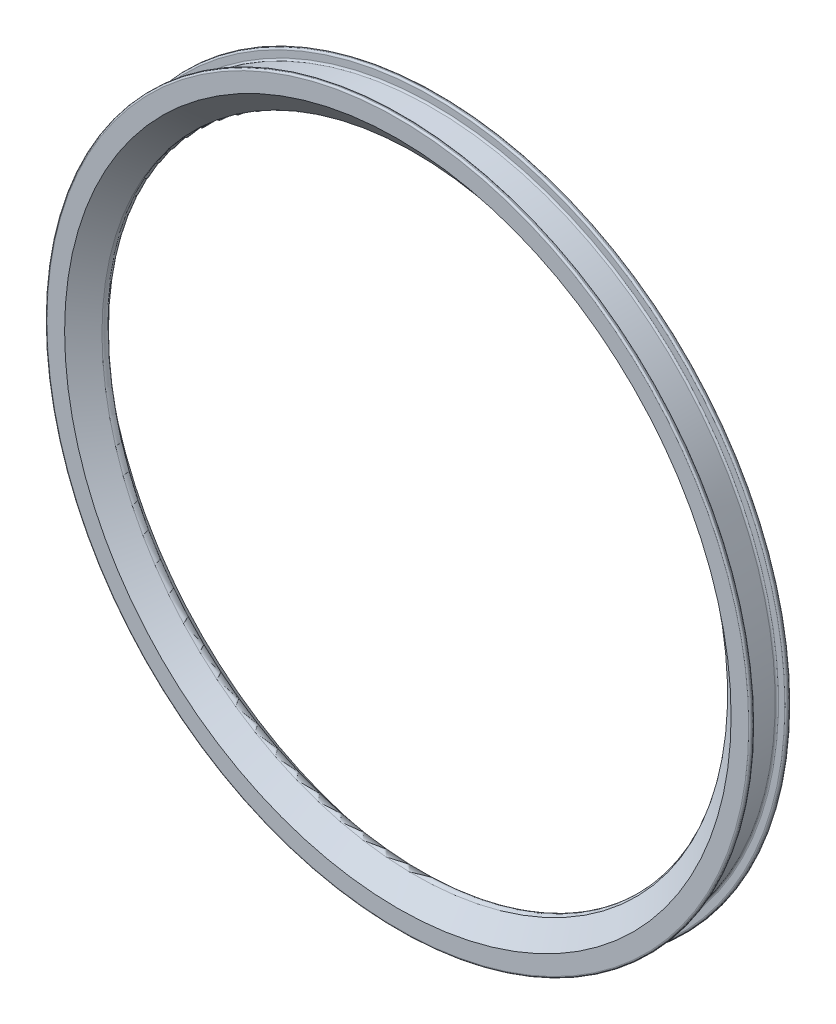
ISO-10303-21;
HEADER;
FILE_DESCRIPTION(('STEP AP214'),'2;1');
FILE_NAME('part.step','',(''),(''),'','','');
FILE_SCHEMA(('AUTOMOTIVE_DESIGN { 1 0 10303 214 1 1 1 1 }'));
ENDSEC;
DATA;
#1=APPLICATION_CONTEXT('core data for automotive mechanical design processes');
#2=APPLICATION_PROTOCOL_DEFINITION('international standard','automotive_design',2000,#1);
#3=PRODUCT_CONTEXT('',#1,'mechanical');
#4=PRODUCT('Part','Part','',(#3));
#5=PRODUCT_RELATED_PRODUCT_CATEGORY('part','',(#4));
#6=PRODUCT_DEFINITION_FORMATION('','',#4);
#7=PRODUCT_DEFINITION_CONTEXT('part definition',#1,'design');
#8=PRODUCT_DEFINITION('design','',#6,#7);
#9=PRODUCT_DEFINITION_SHAPE('','',#8);
#10=(LENGTH_UNIT() NAMED_UNIT(*) SI_UNIT(.MILLI.,.METRE.));
#11=(NAMED_UNIT(*) PLANE_ANGLE_UNIT() SI_UNIT($,.RADIAN.));
#12=(NAMED_UNIT(*) SI_UNIT($,.STERADIAN.) SOLID_ANGLE_UNIT());
#13=UNCERTAINTY_MEASURE_WITH_UNIT(LENGTH_MEASURE(1.E-05),#10,'distance_accuracy_value','');
#14=(GEOMETRIC_REPRESENTATION_CONTEXT(3) GLOBAL_UNCERTAINTY_ASSIGNED_CONTEXT((#13)) GLOBAL_UNIT_ASSIGNED_CONTEXT((#10,
#11,#12)) REPRESENTATION_CONTEXT('',''));
#15=CARTESIAN_POINT('',(0.,0.,0.));
#16=DIRECTION('',(0.,0.,1.));
#17=DIRECTION('',(1.,0.,0.));
#18=AXIS2_PLACEMENT_3D('',#15,#16,#17);
#19=CARTESIAN_POINT('',(0.,0.,0.));
#20=DIRECTION('',(0.,0.,1.));
#21=DIRECTION('',(1.,0.,0.));
#22=AXIS2_PLACEMENT_3D('',#19,#20,#21);
#23=CONICAL_SURFACE('',#22,184.,0.879459398025439);
#24=CARTESIAN_POINT('',(0.,0.,1.92598580281172));
#25=DIRECTION('',(0.,0.,-1.));
#26=DIRECTION('',(-1.,0.,0.));
#27=AXIS2_PLACEMENT_3D('',#24,#25,#26);
#28=CIRCLE('',#27,186.327232845064);
#29=CARTESIAN_POINT('',(-186.327232845064,0.,1.92598580281175));
#30=VERTEX_POINT('',#29);
#31=EDGE_CURVE('E80',#30,#30,#28,.T.);
#32=ORIENTED_EDGE('',*,*,#31,.T.);
#33=EDGE_LOOP('',(#32));
#34=FACE_BOUND('',#33,.T.);
#35=CARTESIAN_POINT('',(0.,0.,11.9999999999999));
#36=DIRECTION('',(0.,0.,-1.));
#37=DIRECTION('',(-1.,0.,0.));
#38=AXIS2_PLACEMENT_3D('',#35,#36,#37);
#39=CIRCLE('',#38,198.5);
#40=CARTESIAN_POINT('',(-198.5,0.,11.9999999999999));
#41=VERTEX_POINT('',#40);
#42=EDGE_CURVE('E86',#41,#41,#39,.T.);
#43=ORIENTED_EDGE('',*,*,#42,.F.);
#44=EDGE_LOOP('',(#43));
#45=FACE_BOUND('',#44,.T.);
#46=ADVANCED_FACE('F33',(#34,#45),#23,.F.);
#47=CARTESIAN_POINT('',(0.,0.,-12.0000000000001));
#48=DIRECTION('',(0.,0.,-1.));
#49=DIRECTION('',(-1.,0.,0.));
#50=AXIS2_PLACEMENT_3D('',#47,#48,#49);
#51=CONICAL_SURFACE('',#50,198.5,0.879459398025429);
#52=CARTESIAN_POINT('',(0.,0.,-1.92598580281172));
#53=DIRECTION('',(0.,0.,1.));
#54=DIRECTION('',(1.,0.,0.));
#55=AXIS2_PLACEMENT_3D('',#52,#53,#54);
#56=CIRCLE('',#55,186.327232845064);
#57=CARTESIAN_POINT('',(186.327232845064,0.,-1.92598580281175));
#58=VERTEX_POINT('',#57);
#59=EDGE_CURVE('E77',#58,#58,#56,.T.);
#60=ORIENTED_EDGE('',*,*,#59,.T.);
#61=EDGE_LOOP('',(#60));
#62=FACE_BOUND('',#61,.T.);
#63=CARTESIAN_POINT('',(0.,0.,-12.0000000000001));
#64=DIRECTION('',(0.,0.,-1.));
#65=DIRECTION('',(-1.,0.,0.));
#66=AXIS2_PLACEMENT_3D('',#63,#64,#65);
#67=CIRCLE('',#66,198.5);
#68=CARTESIAN_POINT('',(-198.5,0.,-12.0000000000001));
#69=VERTEX_POINT('',#68);
#70=EDGE_CURVE('E83',#69,#69,#67,.T.);
#71=ORIENTED_EDGE('',*,*,#70,.T.);
#72=EDGE_LOOP('',(#71));
#73=FACE_BOUND('',#72,.T.);
#74=ADVANCED_FACE('F93',(#62,#73),#51,.F.);
#75=CARTESIAN_POINT('',(198.5,0.,-12.0000000000001));
#76=DIRECTION('',(0.,0.,1.));
#77=DIRECTION('',(1.,0.,0.));
#78=AXIS2_PLACEMENT_3D('',#75,#76,#77);
#79=PLANE('',#78);
#80=CARTESIAN_POINT('',(0.,0.,-12.0000000000001));
#81=DIRECTION('',(0.,0.,1.));
#82=DIRECTION('',(1.,0.,0.));
#83=AXIS2_PLACEMENT_3D('',#80,#81,#82);
#84=CIRCLE('',#83,209.);
#85=CARTESIAN_POINT('',(209.,0.,-12.0000000000001));
#86=VERTEX_POINT('',#85);
#87=EDGE_CURVE('E44',#86,#86,#84,.F.);
#88=ORIENTED_EDGE('',*,*,#87,.T.);
#89=EDGE_LOOP('',(#88));
#90=FACE_BOUND('',#89,.T.);
#91=ORIENTED_EDGE('',*,*,#70,.F.);
#92=EDGE_LOOP('',(#91));
#93=FACE_BOUND('',#92,.T.);
#94=ADVANCED_FACE('F99',(#90,#93),#79,.F.);
#95=CARTESIAN_POINT('',(0.,0.,-28.4424478528471));
#96=DIRECTION('',(0.,0.,-1.));
#97=DIRECTION('',(-1.,0.,0.));
#98=AXIS2_PLACEMENT_3D('',#95,#96,#97);
#99=CYLINDRICAL_SURFACE('',#98,210.);
#100=CARTESIAN_POINT('',(0.,0.,-10.5000000000001));
#101=DIRECTION('',(0.,0.,-1.));
#102=DIRECTION('',(-1.,0.,0.));
#103=AXIS2_PLACEMENT_3D('',#100,#101,#102);
#104=CIRCLE('',#103,210.);
#105=CARTESIAN_POINT('',(-210.,0.,-10.5000000000001));
#106=VERTEX_POINT('',#105);
#107=EDGE_CURVE('E56',#106,#106,#104,.T.);
#108=ORIENTED_EDGE('',*,*,#107,.T.);
#109=EDGE_LOOP('',(#108));
#110=FACE_BOUND('',#109,.T.);
#111=CARTESIAN_POINT('',(0.,0.,-11.0000000000001));
#112=DIRECTION('',(0.,0.,1.));
#113=DIRECTION('',(1.,0.,0.));
#114=AXIS2_PLACEMENT_3D('',#111,#112,#113);
#115=CIRCLE('',#114,210.);
#116=CARTESIAN_POINT('',(210.,0.,-11.0000000000001));
#117=VERTEX_POINT('',#116);
#118=EDGE_CURVE('E59',#117,#117,#115,.T.);
#119=ORIENTED_EDGE('',*,*,#118,.T.);
#120=EDGE_LOOP('',(#119));
#121=FACE_BOUND('',#120,.T.);
#122=ADVANCED_FACE('F151',(#110,#121),#99,.T.);
#123=CARTESIAN_POINT('',(210.,0.,-9.50000000000012));
#124=DIRECTION('',(0.,0.,-1.));
#125=DIRECTION('',(-1.,0.,0.));
#126=AXIS2_PLACEMENT_3D('',#123,#124,#125);
#127=PLANE('',#126);
#128=CARTESIAN_POINT('',(0.,0.,-9.50000000000009));
#129=DIRECTION('',(0.,0.,-1.));
#130=DIRECTION('',(-1.,0.,0.));
#131=AXIS2_PLACEMENT_3D('',#128,#129,#130);
#132=CIRCLE('',#131,209.);
#133=CARTESIAN_POINT('',(-209.,0.,-9.50000000000006));
#134=VERTEX_POINT('',#133);
#135=EDGE_CURVE('E48',#134,#134,#132,.F.);
#136=ORIENTED_EDGE('',*,*,#135,.T.);
#137=EDGE_LOOP('',(#136));
#138=FACE_BOUND('',#137,.T.);
#139=CARTESIAN_POINT('',(0.,0.,-9.50000000000009));
#140=DIRECTION('',(0.,0.,-1.));
#141=DIRECTION('',(-1.,0.,0.));
#142=AXIS2_PLACEMENT_3D('',#139,#140,#141);
#143=CIRCLE('',#142,205.25);
#144=CARTESIAN_POINT('',(-205.25,0.,-9.50000000000006));
#145=VERTEX_POINT('',#144);
#146=EDGE_CURVE('E53',#145,#145,#143,.T.);
#147=ORIENTED_EDGE('',*,*,#146,.T.);
#148=EDGE_LOOP('',(#147));
#149=FACE_BOUND('',#148,.T.);
#150=ADVANCED_FACE('F145',(#138,#149),#127,.F.);
#151=CARTESIAN_POINT('',(0.,0.,-28.4424478528471));
#152=DIRECTION('',(0.,0.,-1.));
#153=DIRECTION('',(-1.,0.,0.));
#154=AXIS2_PLACEMENT_3D('',#151,#152,#153);
#155=CYLINDRICAL_SURFACE('',#154,204.25);
#156=CARTESIAN_POINT('',(0.,0.,8.49999999999991));
#157=DIRECTION('',(0.,0.,1.));
#158=DIRECTION('',(1.,0.,0.));
#159=AXIS2_PLACEMENT_3D('',#156,#157,#158);
#160=CIRCLE('',#159,204.25);
#161=CARTESIAN_POINT('',(204.25,0.,8.49999999999988));
#162=VERTEX_POINT('',#161);
#163=EDGE_CURVE('E10',#162,#162,#160,.F.);
#164=ORIENTED_EDGE('',*,*,#163,.T.);
#165=EDGE_LOOP('',(#164));
#166=FACE_BOUND('',#165,.T.);
#167=CARTESIAN_POINT('',(0.,0.,-8.50000000000009));
#168=DIRECTION('',(0.,0.,-1.));
#169=DIRECTION('',(-1.,0.,0.));
#170=AXIS2_PLACEMENT_3D('',#167,#168,#169);
#171=CIRCLE('',#170,204.25);
#172=CARTESIAN_POINT('',(-204.25,0.,-8.50000000000006));
#173=VERTEX_POINT('',#172);
#174=EDGE_CURVE('E40',#173,#173,#171,.F.);
#175=ORIENTED_EDGE('',*,*,#174,.T.);
#176=EDGE_LOOP('',(#175));
#177=FACE_BOUND('',#176,.T.);
#178=ADVANCED_FACE('F136',(#166,#177),#155,.T.);
#179=CARTESIAN_POINT('',(204.25,0.,9.49999999999988));
#180=DIRECTION('',(0.,0.,1.));
#181=DIRECTION('',(1.,0.,0.));
#182=AXIS2_PLACEMENT_3D('',#179,#180,#181);
#183=PLANE('',#182);
#184=CARTESIAN_POINT('',(0.,0.,9.49999999999991));
#185=DIRECTION('',(0.,0.,1.));
#186=DIRECTION('',(1.,0.,0.));
#187=AXIS2_PLACEMENT_3D('',#184,#185,#186);
#188=CIRCLE('',#187,209.);
#189=CARTESIAN_POINT('',(209.,0.,9.49999999999988));
#190=VERTEX_POINT('',#189);
#191=EDGE_CURVE('E62',#190,#190,#188,.F.);
#192=ORIENTED_EDGE('',*,*,#191,.T.);
#193=EDGE_LOOP('',(#192));
#194=FACE_BOUND('',#193,.T.);
#195=CARTESIAN_POINT('',(0.,0.,9.49999999999991));
#196=DIRECTION('',(0.,0.,1.));
#197=DIRECTION('',(1.,0.,0.));
#198=AXIS2_PLACEMENT_3D('',#195,#196,#197);
#199=CIRCLE('',#198,205.25);
#200=CARTESIAN_POINT('',(205.25,0.,9.49999999999988));
#201=VERTEX_POINT('',#200);
#202=EDGE_CURVE('E65',#201,#201,#199,.T.);
#203=ORIENTED_EDGE('',*,*,#202,.T.);
#204=EDGE_LOOP('',(#203));
#205=FACE_BOUND('',#204,.T.);
#206=ADVANCED_FACE('F133',(#194,#205),#183,.F.);
#207=CARTESIAN_POINT('',(0.,0.,-28.4424478528471));
#208=DIRECTION('',(0.,0.,-1.));
#209=DIRECTION('',(-1.,0.,0.));
#210=AXIS2_PLACEMENT_3D('',#207,#208,#209);
#211=CYLINDRICAL_SURFACE('',#210,210.);
#212=CARTESIAN_POINT('',(0.,0.,10.9999999999999));
#213=DIRECTION('',(0.,0.,-1.));
#214=DIRECTION('',(-1.,0.,0.));
#215=AXIS2_PLACEMENT_3D('',#212,#213,#214);
#216=CIRCLE('',#215,210.);
#217=CARTESIAN_POINT('',(-210.,0.,10.9999999999999));
#218=VERTEX_POINT('',#217);
#219=EDGE_CURVE('E71',#218,#218,#216,.T.);
#220=ORIENTED_EDGE('',*,*,#219,.T.);
#221=EDGE_LOOP('',(#220));
#222=FACE_BOUND('',#221,.T.);
#223=CARTESIAN_POINT('',(0.,0.,10.4999999999999));
#224=DIRECTION('',(0.,0.,1.));
#225=DIRECTION('',(1.,0.,0.));
#226=AXIS2_PLACEMENT_3D('',#223,#224,#225);
#227=CIRCLE('',#226,210.);
#228=CARTESIAN_POINT('',(210.,0.,10.4999999999999));
#229=VERTEX_POINT('',#228);
#230=EDGE_CURVE('E74',#229,#229,#227,.T.);
#231=ORIENTED_EDGE('',*,*,#230,.T.);
#232=EDGE_LOOP('',(#231));
#233=FACE_BOUND('',#232,.T.);
#234=ADVANCED_FACE('F135',(#222,#233),#211,.T.);
#235=CARTESIAN_POINT('',(210.,0.,11.9999999999999));
#236=DIRECTION('',(0.,0.,-1.));
#237=DIRECTION('',(-1.,0.,0.));
#238=AXIS2_PLACEMENT_3D('',#235,#236,#237);
#239=PLANE('',#238);
#240=CARTESIAN_POINT('',(0.,0.,11.9999999999999));
#241=DIRECTION('',(0.,0.,-1.));
#242=DIRECTION('',(-1.,0.,0.));
#243=AXIS2_PLACEMENT_3D('',#240,#241,#242);
#244=CIRCLE('',#243,209.);
#245=CARTESIAN_POINT('',(-209.,0.,11.9999999999999));
#246=VERTEX_POINT('',#245);
#247=EDGE_CURVE('E68',#246,#246,#244,.F.);
#248=ORIENTED_EDGE('',*,*,#247,.T.);
#249=EDGE_LOOP('',(#248));
#250=FACE_BOUND('',#249,.T.);
#251=ORIENTED_EDGE('',*,*,#42,.T.);
#252=EDGE_LOOP('',(#251));
#253=FACE_BOUND('',#252,.T.);
#254=ADVANCED_FACE('F90',(#250,#253),#239,.F.);
#255=CARTESIAN_POINT('',(0.,0.,0.));
#256=DIRECTION('',(0.,0.,1.));
#257=DIRECTION('',(1.,0.,0.));
#258=AXIS2_PLACEMENT_3D('',#255,#256,#257);
#259=TOROIDAL_SURFACE('',#258,187.92115213015,2.5);
#260=ORIENTED_EDGE('',*,*,#59,.F.);
#261=EDGE_LOOP('',(#260));
#262=FACE_BOUND('',#261,.T.);
#263=ORIENTED_EDGE('',*,*,#31,.F.);
#264=EDGE_LOOP('',(#263));
#265=FACE_BOUND('',#264,.T.);
#266=ADVANCED_FACE('F104',(#262,#265),#259,.T.);
#267=CARTESIAN_POINT('',(0.,0.,10.9999999999999));
#268=DIRECTION('',(0.,0.,-1.));
#269=DIRECTION('',(-1.,0.,0.));
#270=AXIS2_PLACEMENT_3D('',#267,#268,#269);
#271=TOROIDAL_SURFACE('',#270,209.,1.);
#272=ORIENTED_EDGE('',*,*,#247,.F.);
#273=EDGE_LOOP('',(#272));
#274=FACE_BOUND('',#273,.T.);
#275=ORIENTED_EDGE('',*,*,#219,.F.);
#276=EDGE_LOOP('',(#275));
#277=FACE_BOUND('',#276,.T.);
#278=ADVANCED_FACE('F107',(#274,#277),#271,.T.);
#279=CARTESIAN_POINT('',(0.,0.,10.4999999999999));
#280=DIRECTION('',(0.,0.,1.));
#281=DIRECTION('',(1.,0.,0.));
#282=AXIS2_PLACEMENT_3D('',#279,#280,#281);
#283=TOROIDAL_SURFACE('',#282,209.,1.);
#284=ORIENTED_EDGE('',*,*,#230,.F.);
#285=EDGE_LOOP('',(#284));
#286=FACE_BOUND('',#285,.T.);
#287=ORIENTED_EDGE('',*,*,#191,.F.);
#288=EDGE_LOOP('',(#287));
#289=FACE_BOUND('',#288,.T.);
#290=ADVANCED_FACE('F111',(#286,#289),#283,.T.);
#291=CARTESIAN_POINT('',(0.,0.,-10.5000000000001));
#292=DIRECTION('',(0.,0.,-1.));
#293=DIRECTION('',(-1.,0.,0.));
#294=AXIS2_PLACEMENT_3D('',#291,#292,#293);
#295=TOROIDAL_SURFACE('',#294,209.,1.);
#296=ORIENTED_EDGE('',*,*,#135,.F.);
#297=EDGE_LOOP('',(#296));
#298=FACE_BOUND('',#297,.T.);
#299=ORIENTED_EDGE('',*,*,#107,.F.);
#300=EDGE_LOOP('',(#299));
#301=FACE_BOUND('',#300,.T.);
#302=ADVANCED_FACE('F115',(#298,#301),#295,.T.);
#303=CARTESIAN_POINT('',(0.,0.,-11.0000000000001));
#304=DIRECTION('',(0.,0.,1.));
#305=DIRECTION('',(1.,0.,0.));
#306=AXIS2_PLACEMENT_3D('',#303,#304,#305);
#307=TOROIDAL_SURFACE('',#306,209.,1.);
#308=ORIENTED_EDGE('',*,*,#118,.F.);
#309=EDGE_LOOP('',(#308));
#310=FACE_BOUND('',#309,.T.);
#311=ORIENTED_EDGE('',*,*,#87,.F.);
#312=EDGE_LOOP('',(#311));
#313=FACE_BOUND('',#312,.T.);
#314=ADVANCED_FACE('F119',(#310,#313),#307,.T.);
#315=CARTESIAN_POINT('',(0.,0.,8.49999999999991));
#316=DIRECTION('',(0.,0.,1.));
#317=DIRECTION('',(1.,0.,0.));
#318=AXIS2_PLACEMENT_3D('',#315,#316,#317);
#319=TOROIDAL_SURFACE('',#318,205.25,1.);
#320=ORIENTED_EDGE('',*,*,#202,.F.);
#321=EDGE_LOOP('',(#320));
#322=FACE_BOUND('',#321,.T.);
#323=ORIENTED_EDGE('',*,*,#163,.F.);
#324=EDGE_LOOP('',(#323));
#325=FACE_BOUND('',#324,.T.);
#326=ADVANCED_FACE('F122',(#322,#325),#319,.F.);
#327=CARTESIAN_POINT('',(0.,0.,-8.50000000000009));
#328=DIRECTION('',(0.,0.,-1.));
#329=DIRECTION('',(-1.,0.,0.));
#330=AXIS2_PLACEMENT_3D('',#327,#328,#329);
#331=TOROIDAL_SURFACE('',#330,205.25,1.);
#332=ORIENTED_EDGE('',*,*,#174,.F.);
#333=EDGE_LOOP('',(#332));
#334=FACE_BOUND('',#333,.T.);
#335=ORIENTED_EDGE('',*,*,#146,.F.);
#336=EDGE_LOOP('',(#335));
#337=FACE_BOUND('',#336,.T.);
#338=ADVANCED_FACE('F35',(#334,#337),#331,.F.);
#339=CLOSED_SHELL('',(#46,#74,#94,#122,#150,#178,#206,#234,#254,#266,#278,#290,#302,#314,#326,#338));
#340=MANIFOLD_SOLID_BREP('B2',#339);
#341=ADVANCED_BREP_SHAPE_REPRESENTATION('',(#18,#340),#14);
#342=SHAPE_DEFINITION_REPRESENTATION(#9,#341);
ENDSEC;
END-ISO-10303-21;
